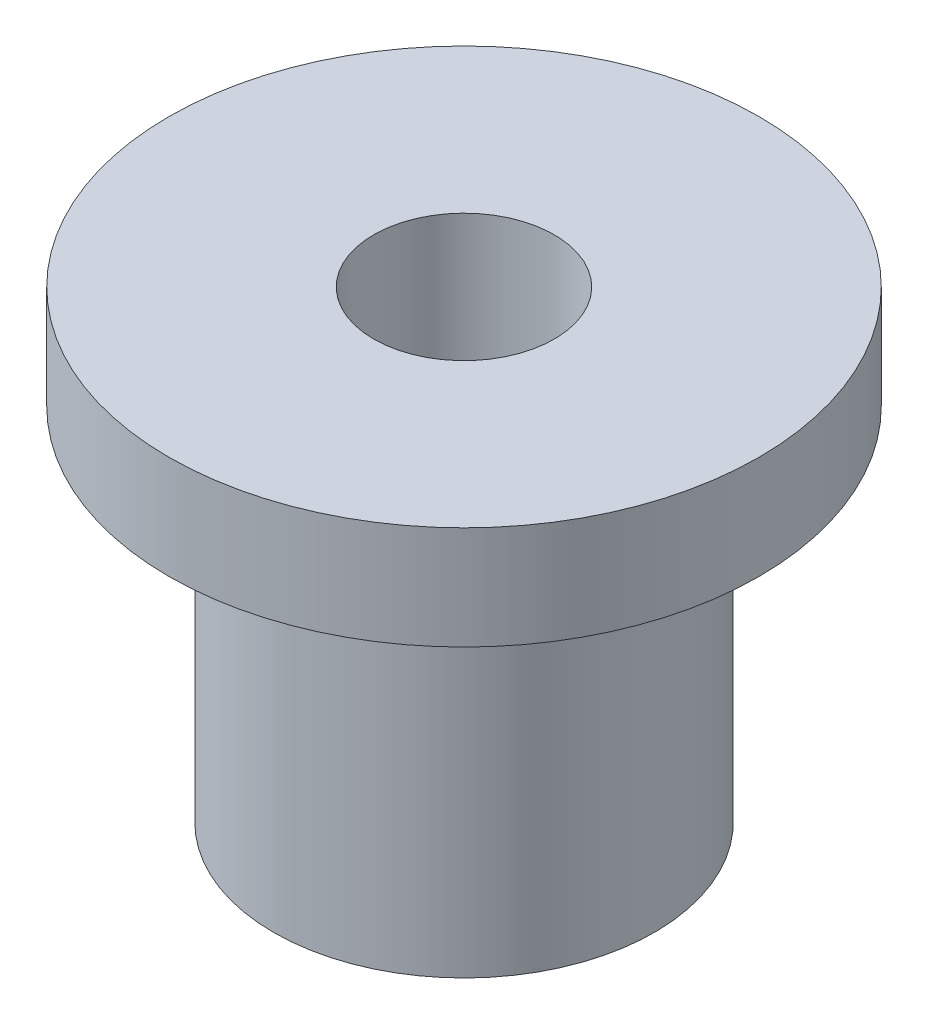
ISO-10303-21;
HEADER;
FILE_DESCRIPTION(('STEP AP214'),'2;1');
FILE_NAME('part.step','',(''),(''),'','','');
FILE_SCHEMA(('AUTOMOTIVE_DESIGN { 1 0 10303 214 1 1 1 1 }'));
ENDSEC;
DATA;
#1=APPLICATION_CONTEXT('core data for automotive mechanical design processes');
#2=APPLICATION_PROTOCOL_DEFINITION('international standard','automotive_design',2000,#1);
#3=PRODUCT_CONTEXT('',#1,'mechanical');
#4=PRODUCT('Part','Part','',(#3));
#5=PRODUCT_RELATED_PRODUCT_CATEGORY('part','',(#4));
#6=PRODUCT_DEFINITION_FORMATION('','',#4);
#7=PRODUCT_DEFINITION_CONTEXT('part definition',#1,'design');
#8=PRODUCT_DEFINITION('design','',#6,#7);
#9=PRODUCT_DEFINITION_SHAPE('','',#8);
#10=(LENGTH_UNIT() NAMED_UNIT(*) SI_UNIT(.MILLI.,.METRE.));
#11=(NAMED_UNIT(*) PLANE_ANGLE_UNIT() SI_UNIT($,.RADIAN.));
#12=(NAMED_UNIT(*) SI_UNIT($,.STERADIAN.) SOLID_ANGLE_UNIT());
#13=UNCERTAINTY_MEASURE_WITH_UNIT(LENGTH_MEASURE(1.E-05),#10,'distance_accuracy_value','');
#14=(GEOMETRIC_REPRESENTATION_CONTEXT(3) GLOBAL_UNCERTAINTY_ASSIGNED_CONTEXT((#13)) GLOBAL_UNIT_ASSIGNED_CONTEXT((#10,
#11,#12)) REPRESENTATION_CONTEXT('',''));
#15=CARTESIAN_POINT('',(0.,0.,0.));
#16=DIRECTION('',(0.,0.,1.));
#17=DIRECTION('',(1.,0.,0.));
#18=AXIS2_PLACEMENT_3D('',#15,#16,#17);
#19=CARTESIAN_POINT('',(0.,0.,0.));
#20=DIRECTION('',(0.,1.,0.));
#21=DIRECTION('',(0.,0.,1.));
#22=AXIS2_PLACEMENT_3D('',#19,#20,#21);
#23=PLANE('',#22);
#24=CARTESIAN_POINT('',(0.,0.,0.));
#25=DIRECTION('',(0.,1.,0.));
#26=DIRECTION('',(0.,0.,1.));
#27=AXIS2_PLACEMENT_3D('',#24,#25,#26);
#28=CIRCLE('',#27,3.687);
#29=CARTESIAN_POINT('',(0.,0.,3.687));
#30=VERTEX_POINT('',#29);
#31=EDGE_CURVE('E56',#30,#30,#28,.T.);
#32=ORIENTED_EDGE('',*,*,#31,.F.);
#33=EDGE_LOOP('',(#32));
#34=FACE_BOUND('',#33,.T.);
#35=CARTESIAN_POINT('',(0.,0.,0.));
#36=DIRECTION('',(0.,1.,0.));
#37=DIRECTION('',(0.,0.,1.));
#38=AXIS2_PLACEMENT_3D('',#35,#36,#37);
#39=CIRCLE('',#38,1.75);
#40=CARTESIAN_POINT('',(0.,0.,1.75));
#41=VERTEX_POINT('',#40);
#42=EDGE_CURVE('E61',#41,#41,#39,.T.);
#43=ORIENTED_EDGE('',*,*,#42,.T.);
#44=EDGE_LOOP('',(#43));
#45=FACE_BOUND('',#44,.T.);
#46=ADVANCED_FACE('F43',(#34,#45),#23,.F.);
#47=CARTESIAN_POINT('',(0.,6.985,0.));
#48=DIRECTION('',(0.,-1.,0.));
#49=DIRECTION('',(0.,0.,-1.));
#50=AXIS2_PLACEMENT_3D('',#47,#48,#49);
#51=CYLINDRICAL_SURFACE('',#50,3.687);
#52=CARTESIAN_POINT('',(0.,6.485,0.));
#53=DIRECTION('',(0.,1.,0.));
#54=DIRECTION('',(0.,0.,1.));
#55=AXIS2_PLACEMENT_3D('',#52,#53,#54);
#56=CIRCLE('',#55,3.687);
#57=CARTESIAN_POINT('',(0.,6.485,3.687));
#58=VERTEX_POINT('',#57);
#59=EDGE_CURVE('E10',#58,#58,#56,.F.);
#60=ORIENTED_EDGE('',*,*,#59,.T.);
#61=EDGE_LOOP('',(#60));
#62=FACE_BOUND('',#61,.T.);
#63=ORIENTED_EDGE('',*,*,#31,.T.);
#64=EDGE_LOOP('',(#63));
#65=FACE_BOUND('',#64,.T.);
#66=ADVANCED_FACE('F94',(#62,#65),#51,.T.);
#67=CARTESIAN_POINT('',(0.,6.985,0.));
#68=DIRECTION('',(0.,-1.,0.));
#69=DIRECTION('',(0.,0.,-1.));
#70=AXIS2_PLACEMENT_3D('',#67,#68,#69);
#71=CYLINDRICAL_SURFACE('',#70,1.75);
#72=ORIENTED_EDGE('',*,*,#42,.F.);
#73=EDGE_LOOP('',(#72));
#74=FACE_BOUND('',#73,.T.);
#75=CARTESIAN_POINT('',(0.,8.985,0.));
#76=DIRECTION('',(0.,1.,0.));
#77=DIRECTION('',(0.,0.,1.));
#78=AXIS2_PLACEMENT_3D('',#75,#76,#77);
#79=CIRCLE('',#78,1.75);
#80=CARTESIAN_POINT('',(0.,8.985,1.75));
#81=VERTEX_POINT('',#80);
#82=EDGE_CURVE('E72',#81,#81,#79,.T.);
#83=ORIENTED_EDGE('',*,*,#82,.T.);
#84=EDGE_LOOP('',(#83));
#85=FACE_BOUND('',#84,.T.);
#86=ADVANCED_FACE('F80',(#74,#85),#71,.F.);
#87=CARTESIAN_POINT('',(0.,8.985,0.));
#88=DIRECTION('',(0.,1.,0.));
#89=DIRECTION('',(0.,0.,1.));
#90=AXIS2_PLACEMENT_3D('',#87,#88,#89);
#91=PLANE('',#90);
#92=CARTESIAN_POINT('',(0.,8.985,0.));
#93=DIRECTION('',(0.,1.,0.));
#94=DIRECTION('',(0.,0.,1.));
#95=AXIS2_PLACEMENT_3D('',#92,#93,#94);
#96=CIRCLE('',#95,5.715);
#97=CARTESIAN_POINT('',(0.,8.985,5.715));
#98=VERTEX_POINT('',#97);
#99=EDGE_CURVE('E67',#98,#98,#96,.T.);
#100=ORIENTED_EDGE('',*,*,#99,.T.);
#101=EDGE_LOOP('',(#100));
#102=FACE_BOUND('',#101,.T.);
#103=ORIENTED_EDGE('',*,*,#82,.F.);
#104=EDGE_LOOP('',(#103));
#105=FACE_BOUND('',#104,.T.);
#106=ADVANCED_FACE('F82',(#102,#105),#91,.T.);
#107=CARTESIAN_POINT('',(0.,6.985,0.));
#108=DIRECTION('',(0.,1.,0.));
#109=DIRECTION('',(0.,0.,1.));
#110=AXIS2_PLACEMENT_3D('',#107,#108,#109);
#111=PLANE('',#110);
#112=CARTESIAN_POINT('',(0.,6.985,0.));
#113=DIRECTION('',(0.,1.,0.));
#114=DIRECTION('',(0.,0.,1.));
#115=AXIS2_PLACEMENT_3D('',#112,#113,#114);
#116=CIRCLE('',#115,4.187);
#117=CARTESIAN_POINT('',(0.,6.985,4.187));
#118=VERTEX_POINT('',#117);
#119=EDGE_CURVE('E51',#118,#118,#116,.T.);
#120=ORIENTED_EDGE('',*,*,#119,.T.);
#121=EDGE_LOOP('',(#120));
#122=FACE_BOUND('',#121,.T.);
#123=CARTESIAN_POINT('',(0.,6.985,0.));
#124=DIRECTION('',(0.,1.,0.));
#125=DIRECTION('',(0.,0.,1.));
#126=AXIS2_PLACEMENT_3D('',#123,#124,#125);
#127=CIRCLE('',#126,5.715);
#128=CARTESIAN_POINT('',(0.,6.985,5.715));
#129=VERTEX_POINT('',#128);
#130=EDGE_CURVE('E68',#129,#129,#127,.T.);
#131=ORIENTED_EDGE('',*,*,#130,.F.);
#132=EDGE_LOOP('',(#131));
#133=FACE_BOUND('',#132,.T.);
#134=ADVANCED_FACE('F84',(#122,#133),#111,.F.);
#135=CARTESIAN_POINT('',(0.,8.985,0.));
#136=DIRECTION('',(0.,-1.,0.));
#137=DIRECTION('',(0.,0.,-1.));
#138=AXIS2_PLACEMENT_3D('',#135,#136,#137);
#139=CYLINDRICAL_SURFACE('',#138,5.715);
#140=ORIENTED_EDGE('',*,*,#99,.F.);
#141=EDGE_LOOP('',(#140));
#142=FACE_BOUND('',#141,.T.);
#143=ORIENTED_EDGE('',*,*,#130,.T.);
#144=EDGE_LOOP('',(#143));
#145=FACE_BOUND('',#144,.T.);
#146=ADVANCED_FACE('F92',(#142,#145),#139,.T.);
#147=CARTESIAN_POINT('',(0.,6.485,0.));
#148=DIRECTION('',(0.,1.,0.));
#149=DIRECTION('',(0.,0.,1.));
#150=AXIS2_PLACEMENT_3D('',#147,#148,#149);
#151=TOROIDAL_SURFACE('',#150,4.187,0.5);
#152=ORIENTED_EDGE('',*,*,#59,.F.);
#153=EDGE_LOOP('',(#152));
#154=FACE_BOUND('',#153,.T.);
#155=ORIENTED_EDGE('',*,*,#119,.F.);
#156=EDGE_LOOP('',(#155));
#157=FACE_BOUND('',#156,.T.);
#158=ADVANCED_FACE('F45',(#154,#157),#151,.F.);
#159=CLOSED_SHELL('',(#46,#66,#86,#106,#134,#146,#158));
#160=MANIFOLD_SOLID_BREP('B2',#159);
#161=ADVANCED_BREP_SHAPE_REPRESENTATION('',(#18,#160),#14);
#162=SHAPE_DEFINITION_REPRESENTATION(#9,#161);
ENDSEC;
END-ISO-10303-21;
